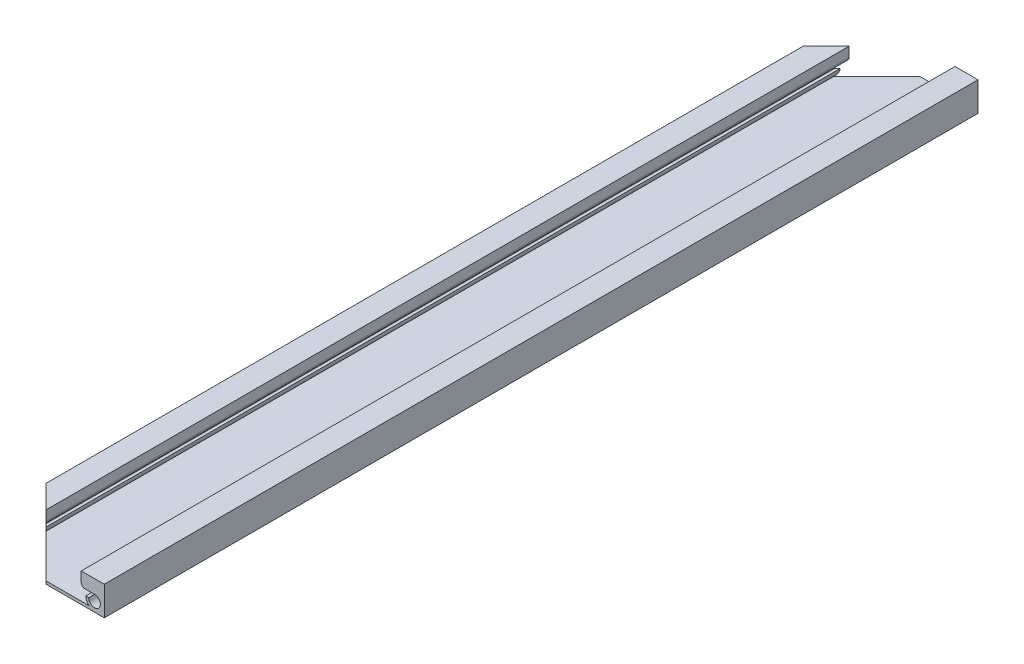
ISO-10303-21;
HEADER;
FILE_DESCRIPTION(('STEP AP214'),'2;1');
FILE_NAME('part.step','',(''),(''),'','','');
FILE_SCHEMA(('AUTOMOTIVE_DESIGN { 1 0 10303 214 1 1 1 1 }'));
ENDSEC;
DATA;
#1=APPLICATION_CONTEXT('core data for automotive mechanical design processes');
#2=APPLICATION_PROTOCOL_DEFINITION('international standard','automotive_design',2000,#1);
#3=PRODUCT_CONTEXT('',#1,'mechanical');
#4=PRODUCT('Part','Part','',(#3));
#5=PRODUCT_RELATED_PRODUCT_CATEGORY('part','',(#4));
#6=PRODUCT_DEFINITION_FORMATION('','',#4);
#7=PRODUCT_DEFINITION_CONTEXT('part definition',#1,'design');
#8=PRODUCT_DEFINITION('design','',#6,#7);
#9=PRODUCT_DEFINITION_SHAPE('','',#8);
#10=(LENGTH_UNIT() NAMED_UNIT(*) SI_UNIT(.MILLI.,.METRE.));
#11=(NAMED_UNIT(*) PLANE_ANGLE_UNIT() SI_UNIT($,.RADIAN.));
#12=(NAMED_UNIT(*) SI_UNIT($,.STERADIAN.) SOLID_ANGLE_UNIT());
#13=UNCERTAINTY_MEASURE_WITH_UNIT(LENGTH_MEASURE(1.E-05),#10,'distance_accuracy_value','');
#14=(GEOMETRIC_REPRESENTATION_CONTEXT(3) GLOBAL_UNCERTAINTY_ASSIGNED_CONTEXT((#13)) GLOBAL_UNIT_ASSIGNED_CONTEXT((#10,
#11,#12)) REPRESENTATION_CONTEXT('',''));
#15=CARTESIAN_POINT('',(0.,0.,0.));
#16=DIRECTION('',(0.,0.,1.));
#17=DIRECTION('',(1.,0.,0.));
#18=AXIS2_PLACEMENT_3D('',#15,#16,#17);
#19=CARTESIAN_POINT('',(-30.,7.5,510.));
#20=DIRECTION('',(0.,-1.,0.));
#21=DIRECTION('',(0.,0.,-1.));
#22=AXIS2_PLACEMENT_3D('',#19,#20,#21);
#23=PLANE('',#22);
#24=DIRECTION('',(0.707106781186546,0.,-0.707106781186549));
#25=VECTOR('',#24,1.);
#26=CARTESIAN_POINT('',(15.0000000000001,7.5,15.));
#27=LINE('',#26,#25);
#28=CARTESIAN_POINT('',(-30.,7.5,60.0000000000002));
#29=VERTEX_POINT('',#28);
#30=CARTESIAN_POINT('',(-18.1568883594902,7.5,48.1568883594904));
#31=VERTEX_POINT('',#30);
#32=EDGE_CURVE('E334',#29,#31,#27,.T.);
#33=ORIENTED_EDGE('',*,*,#32,.F.);
#34=DIRECTION('',(0.,0.,-1.));
#35=VECTOR('',#34,1.);
#36=CARTESIAN_POINT('',(-30.,7.5,510.));
#37=LINE('',#36,#35);
#38=CARTESIAN_POINT('',(-30.,7.5,450.));
#39=VERTEX_POINT('',#38);
#40=EDGE_CURVE('E206',#39,#29,#37,.T.);
#41=ORIENTED_EDGE('',*,*,#40,.F.);
#42=DIRECTION('',(0.707106781186546,0.,0.707106781186549));
#43=VECTOR('',#42,1.);
#44=CARTESIAN_POINT('',(-240.,7.5,239.999999999999));
#45=LINE('',#44,#43);
#46=CARTESIAN_POINT('',(-18.1568883594902,7.5,461.84311164051));
#47=VERTEX_POINT('',#46);
#48=EDGE_CURVE('E344',#39,#47,#45,.T.);
#49=ORIENTED_EDGE('',*,*,#48,.T.);
#50=DIRECTION('',(0.,0.,-1.));
#51=VECTOR('',#50,1.);
#52=CARTESIAN_POINT('',(-18.1568883594903,7.5,510.));
#53=LINE('',#52,#51);
#54=EDGE_CURVE('E285',#47,#31,#53,.T.);
#55=ORIENTED_EDGE('',*,*,#54,.T.);
#56=EDGE_LOOP('',(#33,#41,#49,#55));
#57=FACE_BOUND('',#56,.T.);
#58=ADVANCED_FACE('F43',(#57),#23,.F.);
#59=CARTESIAN_POINT('',(25.,0.5,510.));
#60=DIRECTION('',(0.,1.,0.));
#61=DIRECTION('',(-1.,0.,0.));
#62=AXIS2_PLACEMENT_3D('',#59,#60,#61);
#63=PLANE('',#62);
#64=DIRECTION('',(-0.707106781186546,0.,0.707106781186549));
#65=VECTOR('',#64,1.);
#66=CARTESIAN_POINT('',(-227.5,0.499999999999999,257.500000000001));
#67=LINE('',#66,#65);
#68=CARTESIAN_POINT('',(-20.1568883594903,0.5,50.1568883594905));
#69=VERTEX_POINT('',#68);
#70=CARTESIAN_POINT('',(-25.,0.5,55.0000000000003));
#71=VERTEX_POINT('',#70);
#72=EDGE_CURVE('E275',#69,#71,#67,.T.);
#73=ORIENTED_EDGE('',*,*,#72,.F.);
#74=DIRECTION('',(0.,0.,-1.));
#75=VECTOR('',#74,1.);
#76=CARTESIAN_POINT('',(-20.1568883594903,0.5,510.));
#77=LINE('',#76,#75);
#78=CARTESIAN_POINT('',(-20.1568883594903,0.5,459.84311164051));
#79=VERTEX_POINT('',#78);
#80=EDGE_CURVE('E225',#69,#79,#77,.F.);
#81=ORIENTED_EDGE('',*,*,#80,.T.);
#82=DIRECTION('',(-0.707106781186546,0.,-0.707106781186549));
#83=VECTOR('',#82,1.);
#84=CARTESIAN_POINT('',(27.5,0.5,507.5));
#85=LINE('',#84,#83);
#86=CARTESIAN_POINT('',(-25.,0.5,455.));
#87=VERTEX_POINT('',#86);
#88=EDGE_CURVE('E364',#79,#87,#85,.T.);
#89=ORIENTED_EDGE('',*,*,#88,.T.);
#90=DIRECTION('',(0.,0.,-1.));
#91=VECTOR('',#90,1.);
#92=CARTESIAN_POINT('',(-25.,0.5,510.));
#93=LINE('',#92,#91);
#94=EDGE_CURVE('E300',#87,#71,#93,.T.);
#95=ORIENTED_EDGE('',*,*,#94,.T.);
#96=EDGE_LOOP('',(#73,#81,#89,#95));
#97=FACE_BOUND('',#96,.T.);
#98=ADVANCED_FACE('F382',(#97),#63,.F.);
#99=DIRECTION('',(0.,0.,-1.));
#100=VECTOR('',#99,1.);
#101=CARTESIAN_POINT('',(30.,7.5,510.));
#102=LINE('',#101,#100);
#103=CARTESIAN_POINT('',(30.,7.5,480.));
#104=VERTEX_POINT('',#103);
#105=CARTESIAN_POINT('',(30.,7.5,30.0000000000001));
#106=VERTEX_POINT('',#105);
#107=EDGE_CURVE('E196',#104,#106,#102,.T.);
#108=ORIENTED_EDGE('',*,*,#107,.T.);
#109=DIRECTION('',(-1.,0.,0.));
#110=VECTOR('',#109,1.);
#111=CARTESIAN_POINT('',(30.,7.5,30.0000000000001));
#112=LINE('',#111,#110);
#113=CARTESIAN_POINT('',(18.1431116405097,7.5,30.0000000000001));
#114=VERTEX_POINT('',#113);
#115=EDGE_CURVE('E178',#106,#114,#112,.T.);
#116=ORIENTED_EDGE('',*,*,#115,.T.);
#117=DIRECTION('',(0.,0.,-1.));
#118=VECTOR('',#117,1.);
#119=CARTESIAN_POINT('',(18.1431116405097,7.5,510.));
#120=LINE('',#119,#118);
#121=CARTESIAN_POINT('',(18.1431116405097,7.5,480.));
#122=VERTEX_POINT('',#121);
#123=EDGE_CURVE('E286',#122,#114,#120,.T.);
#124=ORIENTED_EDGE('',*,*,#123,.F.);
#125=DIRECTION('',(1.,0.,0.));
#126=VECTOR('',#125,1.);
#127=CARTESIAN_POINT('',(30.,7.5,480.));
#128=LINE('',#127,#126);
#129=EDGE_CURVE('E189',#122,#104,#128,.T.);
#130=ORIENTED_EDGE('',*,*,#129,.T.);
#131=EDGE_LOOP('',(#108,#116,#124,#130));
#132=FACE_BOUND('',#131,.T.);
#133=ADVANCED_FACE('F203',(#132),#23,.F.);
#134=CARTESIAN_POINT('',(-30.,7.5,510.));
#135=DIRECTION('',(1.,0.,0.));
#136=DIRECTION('',(0.,1.,0.));
#137=AXIS2_PLACEMENT_3D('',#134,#135,#136);
#138=PLANE('',#137);
#139=DIRECTION('',(0.,-1.,0.));
#140=VECTOR('',#139,1.);
#141=CARTESIAN_POINT('',(-30.,7.5,60.0000000000002));
#142=LINE('',#141,#140);
#143=CARTESIAN_POINT('',(-30.,-7.5,60.0000000000002));
#144=VERTEX_POINT('',#143);
#145=EDGE_CURVE('E330',#29,#144,#142,.T.);
#146=ORIENTED_EDGE('',*,*,#145,.T.);
#147=DIRECTION('',(0.,0.,-1.));
#148=VECTOR('',#147,1.);
#149=CARTESIAN_POINT('',(-30.,-7.5,510.));
#150=LINE('',#149,#148);
#151=CARTESIAN_POINT('',(-30.,-7.5,450.));
#152=VERTEX_POINT('',#151);
#153=EDGE_CURVE('E214',#152,#144,#150,.T.);
#154=ORIENTED_EDGE('',*,*,#153,.F.);
#155=DIRECTION('',(0.,-1.,0.));
#156=VECTOR('',#155,1.);
#157=CARTESIAN_POINT('',(-30.,7.5,450.));
#158=LINE('',#157,#156);
#159=EDGE_CURVE('E328',#39,#152,#158,.T.);
#160=ORIENTED_EDGE('',*,*,#159,.F.);
#161=ORIENTED_EDGE('',*,*,#40,.T.);
#162=EDGE_LOOP('',(#146,#154,#160,#161));
#163=FACE_BOUND('',#162,.T.);
#164=ADVANCED_FACE('F327',(#163),#138,.F.);
#165=CARTESIAN_POINT('',(-30.,-7.5,510.));
#166=DIRECTION('',(0.,1.,0.));
#167=DIRECTION('',(0.,0.,1.));
#168=AXIS2_PLACEMENT_3D('',#165,#166,#167);
#169=PLANE('',#168);
#170=DIRECTION('',(0.707106781186546,0.,-0.707106781186549));
#171=VECTOR('',#170,1.);
#172=CARTESIAN_POINT('',(15.0000000000001,-7.5,15.));
#173=LINE('',#172,#171);
#174=CARTESIAN_POINT('',(0.,-7.5,30.0000000000001));
#175=VERTEX_POINT('',#174);
#176=EDGE_CURVE('E320',#144,#175,#173,.T.);
#177=ORIENTED_EDGE('',*,*,#176,.T.);
#178=DIRECTION('',(1.,0.,0.));
#179=VECTOR('',#178,1.);
#180=CARTESIAN_POINT('',(-29.9999999999999,-7.5,30.0000000000001));
#181=LINE('',#180,#179);
#182=CARTESIAN_POINT('',(30.,-7.5,30.0000000000001));
#183=VERTEX_POINT('',#182);
#184=EDGE_CURVE('E66',#175,#183,#181,.T.);
#185=ORIENTED_EDGE('',*,*,#184,.T.);
#186=DIRECTION('',(0.,0.,-1.));
#187=VECTOR('',#186,1.);
#188=CARTESIAN_POINT('',(30.,-7.5,510.));
#189=LINE('',#188,#187);
#190=CARTESIAN_POINT('',(30.,-7.5,480.));
#191=VERTEX_POINT('',#190);
#192=EDGE_CURVE('E198',#191,#183,#189,.T.);
#193=ORIENTED_EDGE('',*,*,#192,.F.);
#194=DIRECTION('',(-1.,0.,0.));
#195=VECTOR('',#194,1.);
#196=CARTESIAN_POINT('',(-30.,-7.5,480.));
#197=LINE('',#196,#195);
#198=CARTESIAN_POINT('',(0.,-7.5,480.));
#199=VERTEX_POINT('',#198);
#200=EDGE_CURVE('E350',#191,#199,#197,.T.);
#201=ORIENTED_EDGE('',*,*,#200,.T.);
#202=DIRECTION('',(0.707106781186546,0.,0.707106781186549));
#203=VECTOR('',#202,1.);
#204=CARTESIAN_POINT('',(-240.,-7.5,239.999999999999));
#205=LINE('',#204,#203);
#206=EDGE_CURVE('E323',#152,#199,#205,.T.);
#207=ORIENTED_EDGE('',*,*,#206,.F.);
#208=ORIENTED_EDGE('',*,*,#153,.T.);
#209=EDGE_LOOP('',(#177,#185,#193,#201,#207,#208));
#210=FACE_BOUND('',#209,.T.);
#211=ADVANCED_FACE('F319',(#210),#169,.F.);
#212=CARTESIAN_POINT('',(-25.,-2.5,510.));
#213=DIRECTION('',(0.,0.,-1.));
#214=DIRECTION('',(-1.,0.,0.));
#215=AXIS2_PLACEMENT_3D('',#212,#213,#214);
#216=CYLINDRICAL_SURFACE('',#215,3.);
#217=CARTESIAN_POINT('',(-25.,-2.5,55.0000000000003));
#218=DIRECTION('',(-0.707106781186549,0.,-0.707106781186546));
#219=DIRECTION('',(0.707106781186546,0.,-0.707106781186549));
#220=AXIS2_PLACEMENT_3D('',#217,#218,#219);
#221=ELLIPSE('',#220,4.2426406871193,3.);
#222=CARTESIAN_POINT('',(-22.,-2.5,52.0000000000001));
#223=VERTEX_POINT('',#222);
#224=EDGE_CURVE('E272',#71,#223,#221,.F.);
#225=ORIENTED_EDGE('',*,*,#224,.F.);
#226=ORIENTED_EDGE('',*,*,#94,.F.);
#227=CARTESIAN_POINT('',(-25.,-2.5,455.));
#228=DIRECTION('',(0.707106781186549,0.,-0.707106781186546));
#229=DIRECTION('',(-0.707106781186546,0.,-0.707106781186549));
#230=AXIS2_PLACEMENT_3D('',#227,#228,#229);
#231=ELLIPSE('',#230,4.2426406871193,3.);
#232=CARTESIAN_POINT('',(-22.,-2.5,458.));
#233=VERTEX_POINT('',#232);
#234=EDGE_CURVE('E360',#87,#233,#231,.F.);
#235=ORIENTED_EDGE('',*,*,#234,.T.);
#236=DIRECTION('',(0.,0.,-1.));
#237=VECTOR('',#236,1.);
#238=CARTESIAN_POINT('',(-22.,-2.5,510.));
#239=LINE('',#238,#237);
#240=EDGE_CURVE('E211',#233,#223,#239,.T.);
#241=ORIENTED_EDGE('',*,*,#240,.T.);
#242=EDGE_LOOP('',(#225,#226,#235,#241));
#243=FACE_BOUND('',#242,.T.);
#244=ADVANCED_FACE('F385',(#243),#216,.F.);
#245=CARTESIAN_POINT('',(25.,-2.5,510.));
#246=DIRECTION('',(0.,0.,-1.));
#247=DIRECTION('',(-1.,0.,0.));
#248=AXIS2_PLACEMENT_3D('',#245,#246,#247);
#249=CYLINDRICAL_SURFACE('',#248,3.);
#250=DIRECTION('',(0.,0.,-1.));
#251=VECTOR('',#250,1.);
#252=CARTESIAN_POINT('',(25.,0.5,510.));
#253=LINE('',#252,#251);
#254=CARTESIAN_POINT('',(25.,0.5,480.));
#255=VERTEX_POINT('',#254);
#256=CARTESIAN_POINT('',(25.,0.5,30.0000000000001));
#257=VERTEX_POINT('',#256);
#258=EDGE_CURVE('E296',#255,#257,#253,.T.);
#259=ORIENTED_EDGE('',*,*,#258,.T.);
#260=CARTESIAN_POINT('',(25.,-2.5,30.0000000000001));
#261=DIRECTION('',(0.,0.,1.));
#262=DIRECTION('',(1.,0.,0.));
#263=AXIS2_PLACEMENT_3D('',#260,#261,#262);
#264=CIRCLE('',#263,3.);
#265=CARTESIAN_POINT('',(22.,-2.5,30.0000000000001));
#266=VERTEX_POINT('',#265);
#267=EDGE_CURVE('E430',#257,#266,#264,.F.);
#268=ORIENTED_EDGE('',*,*,#267,.T.);
#269=DIRECTION('',(0.,0.,-1.));
#270=VECTOR('',#269,1.);
#271=CARTESIAN_POINT('',(22.,-2.5,510.));
#272=LINE('',#271,#270);
#273=CARTESIAN_POINT('',(22.,-2.5,480.));
#274=VERTEX_POINT('',#273);
#275=EDGE_CURVE('E205',#266,#274,#272,.F.);
#276=ORIENTED_EDGE('',*,*,#275,.T.);
#277=CARTESIAN_POINT('',(25.,-2.5,480.));
#278=DIRECTION('',(0.,0.,-1.));
#279=DIRECTION('',(-1.,0.,0.));
#280=AXIS2_PLACEMENT_3D('',#277,#278,#279);
#281=CIRCLE('',#280,3.);
#282=EDGE_CURVE('E407',#274,#255,#281,.F.);
#283=ORIENTED_EDGE('',*,*,#282,.T.);
#284=EDGE_LOOP('',(#259,#268,#276,#283));
#285=FACE_BOUND('',#284,.T.);
#286=ADVANCED_FACE('F457',(#285),#249,.F.);
#287=DIRECTION('',(0.,0.,-1.));
#288=VECTOR('',#287,1.);
#289=CARTESIAN_POINT('',(20.1431116405097,0.5,510.));
#290=LINE('',#289,#288);
#291=CARTESIAN_POINT('',(20.1431116405097,0.5,480.));
#292=VERTEX_POINT('',#291);
#293=CARTESIAN_POINT('',(20.1431116405097,0.5,30.0000000000001));
#294=VERTEX_POINT('',#293);
#295=EDGE_CURVE('E229',#292,#294,#290,.T.);
#296=ORIENTED_EDGE('',*,*,#295,.T.);
#297=DIRECTION('',(1.,0.,0.));
#298=VECTOR('',#297,1.);
#299=CARTESIAN_POINT('',(25.0000000000001,0.5,30.0000000000001));
#300=LINE('',#299,#298);
#301=EDGE_CURVE('E434',#294,#257,#300,.T.);
#302=ORIENTED_EDGE('',*,*,#301,.T.);
#303=ORIENTED_EDGE('',*,*,#258,.F.);
#304=DIRECTION('',(-1.,0.,0.));
#305=VECTOR('',#304,1.);
#306=CARTESIAN_POINT('',(25.,0.5,480.));
#307=LINE('',#306,#305);
#308=EDGE_CURVE('E411',#255,#292,#307,.T.);
#309=ORIENTED_EDGE('',*,*,#308,.T.);
#310=EDGE_LOOP('',(#296,#302,#303,#309));
#311=FACE_BOUND('',#310,.T.);
#312=ADVANCED_FACE('F455',(#311),#63,.F.);
#313=CARTESIAN_POINT('',(-25.,-2.5,510.));
#314=DIRECTION('',(0.,-1.,0.));
#315=DIRECTION('',(1.,0.,0.));
#316=AXIS2_PLACEMENT_3D('',#313,#314,#315);
#317=PLANE('',#316);
#318=DIRECTION('',(0.707106781186546,0.,-0.707106781186549));
#319=VECTOR('',#318,1.);
#320=CARTESIAN_POINT('',(-252.5,-2.49999999999993,282.500000000001));
#321=LINE('',#320,#319);
#322=CARTESIAN_POINT('',(-20.5,-2.5,50.5000000000003));
#323=VERTEX_POINT('',#322);
#324=EDGE_CURVE('E263',#223,#323,#321,.T.);
#325=ORIENTED_EDGE('',*,*,#324,.F.);
#326=ORIENTED_EDGE('',*,*,#240,.F.);
#327=DIRECTION('',(0.707106781186546,0.,0.707106781186549));
#328=VECTOR('',#327,1.);
#329=CARTESIAN_POINT('',(2.50000000000011,-2.50000000000001,482.5));
#330=LINE('',#329,#328);
#331=CARTESIAN_POINT('',(-20.5,-2.5,459.5));
#332=VERTEX_POINT('',#331);
#333=EDGE_CURVE('E356',#233,#332,#330,.T.);
#334=ORIENTED_EDGE('',*,*,#333,.T.);
#335=DIRECTION('',(0.,0.,-1.));
#336=VECTOR('',#335,1.);
#337=CARTESIAN_POINT('',(-20.5,-2.5,510.));
#338=LINE('',#337,#336);
#339=EDGE_CURVE('E304',#332,#323,#338,.T.);
#340=ORIENTED_EDGE('',*,*,#339,.T.);
#341=EDGE_LOOP('',(#325,#326,#334,#340));
#342=FACE_BOUND('',#341,.T.);
#343=ADVANCED_FACE('F389',(#342),#317,.F.);
#344=CARTESIAN_POINT('',(20.5,-2.5,510.));
#345=DIRECTION('',(0.,-1.,0.));
#346=DIRECTION('',(1.,0.,0.));
#347=AXIS2_PLACEMENT_3D('',#344,#345,#346);
#348=PLANE('',#347);
#349=ORIENTED_EDGE('',*,*,#275,.F.);
#350=DIRECTION('',(-1.,0.,0.));
#351=VECTOR('',#350,1.);
#352=CARTESIAN_POINT('',(20.5000000000001,-2.5,30.0000000000001));
#353=LINE('',#352,#351);
#354=CARTESIAN_POINT('',(20.5,-2.5,30.0000000000001));
#355=VERTEX_POINT('',#354);
#356=EDGE_CURVE('E426',#266,#355,#353,.T.);
#357=ORIENTED_EDGE('',*,*,#356,.T.);
#358=DIRECTION('',(0.,0.,-1.));
#359=VECTOR('',#358,1.);
#360=CARTESIAN_POINT('',(20.5,-2.5,510.));
#361=LINE('',#360,#359);
#362=CARTESIAN_POINT('',(20.5,-2.5,480.));
#363=VERTEX_POINT('',#362);
#364=EDGE_CURVE('E292',#363,#355,#361,.T.);
#365=ORIENTED_EDGE('',*,*,#364,.F.);
#366=DIRECTION('',(1.,0.,0.));
#367=VECTOR('',#366,1.);
#368=CARTESIAN_POINT('',(20.5,-2.5,480.));
#369=LINE('',#368,#367);
#370=EDGE_CURVE('E403',#363,#274,#369,.T.);
#371=ORIENTED_EDGE('',*,*,#370,.T.);
#372=EDGE_LOOP('',(#349,#357,#365,#371));
#373=FACE_BOUND('',#372,.T.);
#374=ADVANCED_FACE('F461',(#373),#348,.F.);
#375=CARTESIAN_POINT('',(25.,-2.5,510.));
#376=DIRECTION('',(0.,0.,-1.));
#377=DIRECTION('',(-1.,0.,0.));
#378=AXIS2_PLACEMENT_3D('',#375,#376,#377);
#379=CYLINDRICAL_SURFACE('',#378,4.5);
#380=ORIENTED_EDGE('',*,*,#364,.T.);
#381=CARTESIAN_POINT('',(25.,-2.5,30.0000000000001));
#382=DIRECTION('',(0.,0.,1.));
#383=DIRECTION('',(1.,0.,0.));
#384=AXIS2_PLACEMENT_3D('',#381,#382,#383);
#385=CIRCLE('',#384,4.5);
#386=CARTESIAN_POINT('',(22.1715728752538,-6.,30.0000000000001));
#387=VERTEX_POINT('',#386);
#388=EDGE_CURVE('E253',#355,#387,#385,.T.);
#389=ORIENTED_EDGE('',*,*,#388,.T.);
#390=DIRECTION('',(0.,0.,-1.));
#391=VECTOR('',#390,1.);
#392=CARTESIAN_POINT('',(22.1715728752538,-6.,510.));
#393=LINE('',#392,#391);
#394=CARTESIAN_POINT('',(22.1715728752538,-6.,480.));
#395=VERTEX_POINT('',#394);
#396=EDGE_CURVE('E251',#395,#387,#393,.T.);
#397=ORIENTED_EDGE('',*,*,#396,.F.);
#398=CARTESIAN_POINT('',(25.,-2.5,480.));
#399=DIRECTION('',(0.,0.,-1.));
#400=DIRECTION('',(-1.,0.,0.));
#401=AXIS2_PLACEMENT_3D('',#398,#399,#400);
#402=CIRCLE('',#401,4.5);
#403=EDGE_CURVE('E397',#395,#363,#402,.T.);
#404=ORIENTED_EDGE('',*,*,#403,.T.);
#405=EDGE_LOOP('',(#380,#389,#397,#404));
#406=FACE_BOUND('',#405,.T.);
#407=ADVANCED_FACE('F463',(#406),#379,.T.);
#408=CARTESIAN_POINT('',(-25.,-2.5,510.));
#409=DIRECTION('',(0.,0.,-1.));
#410=DIRECTION('',(-1.,0.,0.));
#411=AXIS2_PLACEMENT_3D('',#408,#409,#410);
#412=CYLINDRICAL_SURFACE('',#411,4.5);
#413=CARTESIAN_POINT('',(-25.,-2.5,55.0000000000003));
#414=DIRECTION('',(-0.707106781186549,0.,-0.707106781186546));
#415=DIRECTION('',(0.707106781186546,0.,-0.707106781186549));
#416=AXIS2_PLACEMENT_3D('',#413,#414,#415);
#417=ELLIPSE('',#416,6.36396103067895,4.5);
#418=CARTESIAN_POINT('',(-22.1715728752538,-6.,52.171572875254));
#419=VERTEX_POINT('',#418);
#420=EDGE_CURVE('E257',#323,#419,#417,.T.);
#421=ORIENTED_EDGE('',*,*,#420,.F.);
#422=ORIENTED_EDGE('',*,*,#339,.F.);
#423=CARTESIAN_POINT('',(-25.,-2.5,455.));
#424=DIRECTION('',(0.707106781186549,0.,-0.707106781186546));
#425=DIRECTION('',(-0.707106781186546,0.,-0.707106781186549));
#426=AXIS2_PLACEMENT_3D('',#423,#424,#425);
#427=ELLIPSE('',#426,6.36396103067895,4.5);
#428=CARTESIAN_POINT('',(-22.1715728752538,-6.,457.828427124746));
#429=VERTEX_POINT('',#428);
#430=EDGE_CURVE('E339',#332,#429,#427,.T.);
#431=ORIENTED_EDGE('',*,*,#430,.T.);
#432=DIRECTION('',(0.,0.,-1.));
#433=VECTOR('',#432,1.);
#434=CARTESIAN_POINT('',(-22.1715728752538,-6.,510.));
#435=LINE('',#434,#433);
#436=EDGE_CURVE('E308',#429,#419,#435,.T.);
#437=ORIENTED_EDGE('',*,*,#436,.T.);
#438=EDGE_LOOP('',(#421,#422,#431,#437));
#439=FACE_BOUND('',#438,.T.);
#440=ADVANCED_FACE('F392',(#439),#412,.T.);
#441=CARTESIAN_POINT('',(22.1715728752538,-6.,510.));
#442=DIRECTION('',(0.,-1.,0.));
#443=DIRECTION('',(0.,0.,-1.));
#444=AXIS2_PLACEMENT_3D('',#441,#442,#443);
#445=PLANE('',#444);
#446=ORIENTED_EDGE('',*,*,#396,.T.);
#447=DIRECTION('',(-1.,0.,0.));
#448=VECTOR('',#447,1.);
#449=CARTESIAN_POINT('',(22.1715728752539,-6.,30.0000000000001));
#450=LINE('',#449,#448);
#451=CARTESIAN_POINT('',(0.,-6.,30.0000000000001));
#452=VERTEX_POINT('',#451);
#453=EDGE_CURVE('E238',#387,#452,#450,.T.);
#454=ORIENTED_EDGE('',*,*,#453,.T.);
#455=DIRECTION('',(0.707106781186546,0.,-0.707106781186549));
#456=VECTOR('',#455,1.);
#457=CARTESIAN_POINT('',(-228.914213562373,-6.,258.914213562374));
#458=LINE('',#457,#456);
#459=EDGE_CURVE('E248',#419,#452,#458,.T.);
#460=ORIENTED_EDGE('',*,*,#459,.F.);
#461=ORIENTED_EDGE('',*,*,#436,.F.);
#462=DIRECTION('',(0.707106781186546,0.,0.707106781186549));
#463=VECTOR('',#462,1.);
#464=CARTESIAN_POINT('',(26.0857864376269,-6.,506.085786437627));
#465=LINE('',#464,#463);
#466=CARTESIAN_POINT('',(0.,-6.,480.));
#467=VERTEX_POINT('',#466);
#468=EDGE_CURVE('E333',#429,#467,#465,.T.);
#469=ORIENTED_EDGE('',*,*,#468,.T.);
#470=DIRECTION('',(1.,0.,0.));
#471=VECTOR('',#470,1.);
#472=CARTESIAN_POINT('',(22.1715728752538,-6.,480.));
#473=LINE('',#472,#471);
#474=EDGE_CURVE('E59',#467,#395,#473,.T.);
#475=ORIENTED_EDGE('',*,*,#474,.T.);
#476=EDGE_LOOP('',(#446,#454,#460,#461,#469,#475));
#477=FACE_BOUND('',#476,.T.);
#478=ADVANCED_FACE('F246',(#477),#445,.F.);
#479=CARTESIAN_POINT('',(18.1431116405097,0.5,510.));
#480=DIRECTION('',(1.,0.,0.));
#481=DIRECTION('',(0.,0.,-1.));
#482=AXIS2_PLACEMENT_3D('',#479,#480,#481);
#483=PLANE('',#482);
#484=ORIENTED_EDGE('',*,*,#123,.T.);
#485=DIRECTION('',(0.,-1.,0.));
#486=VECTOR('',#485,1.);
#487=CARTESIAN_POINT('',(18.1431116405097,0.5,30.0000000000001));
#488=LINE('',#487,#486);
#489=CARTESIAN_POINT('',(18.1431116405097,2.5,30.0000000000001));
#490=VERTEX_POINT('',#489);
#491=EDGE_CURVE('E183',#114,#490,#488,.T.);
#492=ORIENTED_EDGE('',*,*,#491,.T.);
#493=DIRECTION('',(0.,0.,-1.));
#494=VECTOR('',#493,1.);
#495=CARTESIAN_POINT('',(18.1431116405097,2.5,510.));
#496=LINE('',#495,#494);
#497=CARTESIAN_POINT('',(18.1431116405097,2.5,480.));
#498=VERTEX_POINT('',#497);
#499=EDGE_CURVE('E233',#490,#498,#496,.F.);
#500=ORIENTED_EDGE('',*,*,#499,.T.);
#501=DIRECTION('',(0.,1.,0.));
#502=VECTOR('',#501,1.);
#503=CARTESIAN_POINT('',(18.1431116405097,0.5,480.));
#504=LINE('',#503,#502);
#505=EDGE_CURVE('E415',#498,#122,#504,.T.);
#506=ORIENTED_EDGE('',*,*,#505,.T.);
#507=EDGE_LOOP('',(#484,#492,#500,#506));
#508=FACE_BOUND('',#507,.T.);
#509=ADVANCED_FACE('F448',(#508),#483,.F.);
#510=CARTESIAN_POINT('',(-18.1568883594903,7.5,510.));
#511=DIRECTION('',(-1.,0.,0.));
#512=DIRECTION('',(0.,0.,1.));
#513=AXIS2_PLACEMENT_3D('',#510,#511,#512);
#514=PLANE('',#513);
#515=DIRECTION('',(0.,-1.,0.));
#516=VECTOR('',#515,1.);
#517=CARTESIAN_POINT('',(-18.1568883594903,7.5,48.1568883594905));
#518=LINE('',#517,#516);
#519=CARTESIAN_POINT('',(-18.1568883594903,2.5,48.1568883594906));
#520=VERTEX_POINT('',#519);
#521=EDGE_CURVE('E282',#31,#520,#518,.T.);
#522=ORIENTED_EDGE('',*,*,#521,.F.);
#523=ORIENTED_EDGE('',*,*,#54,.F.);
#524=DIRECTION('',(0.,-1.,0.));
#525=VECTOR('',#524,1.);
#526=CARTESIAN_POINT('',(-18.1568883594903,7.5,461.84311164051));
#527=LINE('',#526,#525);
#528=CARTESIAN_POINT('',(-18.1568883594903,2.5,461.84311164051));
#529=VERTEX_POINT('',#528);
#530=EDGE_CURVE('E259',#47,#529,#527,.T.);
#531=ORIENTED_EDGE('',*,*,#530,.T.);
#532=DIRECTION('',(0.,0.,-1.));
#533=VECTOR('',#532,1.);
#534=CARTESIAN_POINT('',(-18.1568883594903,2.5,510.));
#535=LINE('',#534,#533);
#536=EDGE_CURVE('E221',#529,#520,#535,.T.);
#537=ORIENTED_EDGE('',*,*,#536,.T.);
#538=EDGE_LOOP('',(#522,#523,#531,#537));
#539=FACE_BOUND('',#538,.T.);
#540=ADVANCED_FACE('F377',(#539),#514,.F.);
#541=CARTESIAN_POINT('',(-20.1568883594903,2.5,510.));
#542=DIRECTION('',(0.,0.,-1.));
#543=DIRECTION('',(-1.,0.,0.));
#544=AXIS2_PLACEMENT_3D('',#541,#542,#543);
#545=CYLINDRICAL_SURFACE('',#544,2.);
#546=ORIENTED_EDGE('',*,*,#80,.F.);
#547=CARTESIAN_POINT('',(-20.1568883594903,2.5,50.1568883594906));
#548=DIRECTION('',(-0.707106781186549,0.,-0.707106781186546));
#549=DIRECTION('',(0.707106781186546,0.,-0.707106781186549));
#550=AXIS2_PLACEMENT_3D('',#547,#548,#549);
#551=ELLIPSE('',#550,2.8284271247462,2.);
#552=EDGE_CURVE('E278',#69,#520,#551,.F.);
#553=ORIENTED_EDGE('',*,*,#552,.T.);
#554=ORIENTED_EDGE('',*,*,#536,.F.);
#555=CARTESIAN_POINT('',(-20.1568883594903,2.5,459.84311164051));
#556=DIRECTION('',(0.707106781186549,0.,-0.707106781186546));
#557=DIRECTION('',(-0.707106781186546,0.,-0.707106781186549));
#558=AXIS2_PLACEMENT_3D('',#555,#556,#557);
#559=ELLIPSE('',#558,2.8284271247462,2.);
#560=EDGE_CURVE('E266',#79,#529,#559,.F.);
#561=ORIENTED_EDGE('',*,*,#560,.F.);
#562=EDGE_LOOP('',(#546,#553,#554,#561));
#563=FACE_BOUND('',#562,.T.);
#564=ADVANCED_FACE('F378',(#563),#545,.T.);
#565=CARTESIAN_POINT('',(20.1431116405097,2.5,510.));
#566=DIRECTION('',(0.,0.,-1.));
#567=DIRECTION('',(-1.,0.,0.));
#568=AXIS2_PLACEMENT_3D('',#565,#566,#567);
#569=CYLINDRICAL_SURFACE('',#568,2.);
#570=CARTESIAN_POINT('',(20.1431116405097,2.5,30.0000000000001));
#571=DIRECTION('',(0.,0.,1.));
#572=DIRECTION('',(1.,0.,0.));
#573=AXIS2_PLACEMENT_3D('',#570,#571,#572);
#574=CIRCLE('',#573,2.);
#575=EDGE_CURVE('E200',#294,#490,#574,.F.);
#576=ORIENTED_EDGE('',*,*,#575,.F.);
#577=ORIENTED_EDGE('',*,*,#295,.F.);
#578=CARTESIAN_POINT('',(20.1431116405097,2.5,480.));
#579=DIRECTION('',(0.,0.,-1.));
#580=DIRECTION('',(-1.,0.,0.));
#581=AXIS2_PLACEMENT_3D('',#578,#579,#580);
#582=CIRCLE('',#581,2.);
#583=EDGE_CURVE('E419',#498,#292,#582,.F.);
#584=ORIENTED_EDGE('',*,*,#583,.F.);
#585=ORIENTED_EDGE('',*,*,#499,.F.);
#586=EDGE_LOOP('',(#576,#577,#584,#585));
#587=FACE_BOUND('',#586,.T.);
#588=ADVANCED_FACE('F45',(#587),#569,.T.);
#589=CARTESIAN_POINT('',(30.,7.5,510.));
#590=DIRECTION('',(-1.,0.,0.));
#591=DIRECTION('',(0.,-1.,0.));
#592=AXIS2_PLACEMENT_3D('',#589,#590,#591);
#593=PLANE('',#592);
#594=ORIENTED_EDGE('',*,*,#192,.T.);
#595=DIRECTION('',(0.,-1.,0.));
#596=VECTOR('',#595,1.);
#597=CARTESIAN_POINT('',(30.,7.5,30.0000000000001));
#598=LINE('',#597,#596);
#599=EDGE_CURVE('E181',#106,#183,#598,.T.);
#600=ORIENTED_EDGE('',*,*,#599,.F.);
#601=ORIENTED_EDGE('',*,*,#107,.F.);
#602=DIRECTION('',(0.,-1.,0.));
#603=VECTOR('',#602,1.);
#604=CARTESIAN_POINT('',(30.,7.5,480.));
#605=LINE('',#604,#603);
#606=EDGE_CURVE('E444',#104,#191,#605,.T.);
#607=ORIENTED_EDGE('',*,*,#606,.T.);
#608=EDGE_LOOP('',(#594,#600,#601,#607));
#609=FACE_BOUND('',#608,.T.);
#610=ADVANCED_FACE('F194',(#609),#593,.F.);
#611=CARTESIAN_POINT('',(-240.,7.5,239.999999999999));
#612=DIRECTION('',(0.707106781186549,0.,-0.707106781186546));
#613=DIRECTION('',(-0.707106781186546,0.,-0.707106781186549));
#614=AXIS2_PLACEMENT_3D('',#611,#612,#613);
#615=PLANE('',#614);
#616=ORIENTED_EDGE('',*,*,#206,.T.);
#617=DIRECTION('',(0.,1.,0.));
#618=VECTOR('',#617,1.);
#619=CARTESIAN_POINT('',(0.,7.5,480.));
#620=LINE('',#619,#618);
#621=EDGE_CURVE('E11',#199,#467,#620,.T.);
#622=ORIENTED_EDGE('',*,*,#621,.T.);
#623=ORIENTED_EDGE('',*,*,#468,.F.);
#624=ORIENTED_EDGE('',*,*,#430,.F.);
#625=ORIENTED_EDGE('',*,*,#333,.F.);
#626=ORIENTED_EDGE('',*,*,#234,.F.);
#627=ORIENTED_EDGE('',*,*,#88,.F.);
#628=ORIENTED_EDGE('',*,*,#560,.T.);
#629=ORIENTED_EDGE('',*,*,#530,.F.);
#630=ORIENTED_EDGE('',*,*,#48,.F.);
#631=ORIENTED_EDGE('',*,*,#159,.T.);
#632=EDGE_LOOP('',(#616,#622,#623,#624,#625,#626,#627,#628,#629,#630,#631));
#633=FACE_BOUND('',#632,.T.);
#634=ADVANCED_FACE('F370',(#633),#615,.F.);
#635=CARTESIAN_POINT('',(15.0000000000001,7.5,15.));
#636=DIRECTION('',(-0.707106781186549,0.,-0.707106781186546));
#637=DIRECTION('',(-0.707106781186546,0.,0.707106781186549));
#638=AXIS2_PLACEMENT_3D('',#635,#636,#637);
#639=PLANE('',#638);
#640=DIRECTION('',(0.,1.,0.));
#641=VECTOR('',#640,1.);
#642=CARTESIAN_POINT('',(0.,7.5,30.0000000000001));
#643=LINE('',#642,#641);
#644=EDGE_CURVE('E52',#175,#452,#643,.T.);
#645=ORIENTED_EDGE('',*,*,#644,.F.);
#646=ORIENTED_EDGE('',*,*,#176,.F.);
#647=ORIENTED_EDGE('',*,*,#145,.F.);
#648=ORIENTED_EDGE('',*,*,#32,.T.);
#649=ORIENTED_EDGE('',*,*,#521,.T.);
#650=ORIENTED_EDGE('',*,*,#552,.F.);
#651=ORIENTED_EDGE('',*,*,#72,.T.);
#652=ORIENTED_EDGE('',*,*,#224,.T.);
#653=ORIENTED_EDGE('',*,*,#324,.T.);
#654=ORIENTED_EDGE('',*,*,#420,.T.);
#655=ORIENTED_EDGE('',*,*,#459,.T.);
#656=EDGE_LOOP('',(#645,#646,#647,#648,#649,#650,#651,#652,#653,#654,#655));
#657=FACE_BOUND('',#656,.T.);
#658=ADVANCED_FACE('F255',(#657),#639,.T.);
#659=CARTESIAN_POINT('',(30.,7.5,30.0000000000001));
#660=DIRECTION('',(0.,0.,1.));
#661=DIRECTION('',(1.,0.,0.));
#662=AXIS2_PLACEMENT_3D('',#659,#660,#661);
#663=PLANE('',#662);
#664=ORIENTED_EDGE('',*,*,#644,.T.);
#665=ORIENTED_EDGE('',*,*,#453,.F.);
#666=ORIENTED_EDGE('',*,*,#388,.F.);
#667=ORIENTED_EDGE('',*,*,#356,.F.);
#668=ORIENTED_EDGE('',*,*,#267,.F.);
#669=ORIENTED_EDGE('',*,*,#301,.F.);
#670=ORIENTED_EDGE('',*,*,#575,.T.);
#671=ORIENTED_EDGE('',*,*,#491,.F.);
#672=ORIENTED_EDGE('',*,*,#115,.F.);
#673=ORIENTED_EDGE('',*,*,#599,.T.);
#674=ORIENTED_EDGE('',*,*,#184,.F.);
#675=EDGE_LOOP('',(#664,#665,#666,#667,#668,#669,#670,#671,#672,#673,#674));
#676=FACE_BOUND('',#675,.T.);
#677=ADVANCED_FACE('F180',(#676),#663,.F.);
#678=CARTESIAN_POINT('',(30.,7.5,480.));
#679=DIRECTION('',(0.,0.,-1.));
#680=DIRECTION('',(-1.,0.,0.));
#681=AXIS2_PLACEMENT_3D('',#678,#679,#680);
#682=PLANE('',#681);
#683=ORIENTED_EDGE('',*,*,#606,.F.);
#684=ORIENTED_EDGE('',*,*,#129,.F.);
#685=ORIENTED_EDGE('',*,*,#505,.F.);
#686=ORIENTED_EDGE('',*,*,#583,.T.);
#687=ORIENTED_EDGE('',*,*,#308,.F.);
#688=ORIENTED_EDGE('',*,*,#282,.F.);
#689=ORIENTED_EDGE('',*,*,#370,.F.);
#690=ORIENTED_EDGE('',*,*,#403,.F.);
#691=ORIENTED_EDGE('',*,*,#474,.F.);
#692=ORIENTED_EDGE('',*,*,#621,.F.);
#693=ORIENTED_EDGE('',*,*,#200,.F.);
#694=EDGE_LOOP('',(#683,#684,#685,#686,#687,#688,#689,#690,#691,#692,#693));
#695=FACE_BOUND('',#694,.T.);
#696=ADVANCED_FACE('F393',(#695),#682,.F.);
#697=CLOSED_SHELL('',(#58,#98,#133,#164,#211,#244,#286,#312,#343,#374,#407,#440,#478,#509,#540,
#564,#588,#610,#634,#658,#677,#696));
#698=MANIFOLD_SOLID_BREP('B2',#697);
#699=ADVANCED_BREP_SHAPE_REPRESENTATION('',(#18,#698),#14);
#700=SHAPE_DEFINITION_REPRESENTATION(#9,#699);
ENDSEC;
END-ISO-10303-21;
